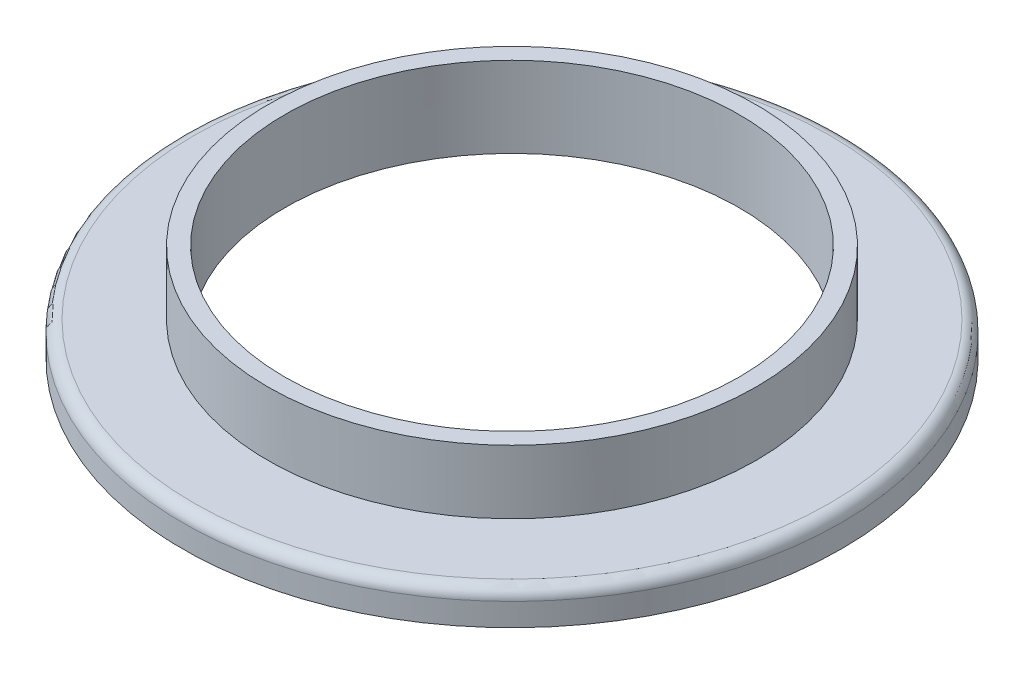
ISO-10303-21;
HEADER;
FILE_DESCRIPTION(('STEP AP214'),'2;1');
FILE_NAME('part.step','',(''),(''),'','','');
FILE_SCHEMA(('AUTOMOTIVE_DESIGN { 1 0 10303 214 1 1 1 1 }'));
ENDSEC;
DATA;
#1=APPLICATION_CONTEXT('core data for automotive mechanical design processes');
#2=APPLICATION_PROTOCOL_DEFINITION('international standard','automotive_design',2000,#1);
#3=PRODUCT_CONTEXT('',#1,'mechanical');
#4=PRODUCT('Part','Part','',(#3));
#5=PRODUCT_RELATED_PRODUCT_CATEGORY('part','',(#4));
#6=PRODUCT_DEFINITION_FORMATION('','',#4);
#7=PRODUCT_DEFINITION_CONTEXT('part definition',#1,'design');
#8=PRODUCT_DEFINITION('design','',#6,#7);
#9=PRODUCT_DEFINITION_SHAPE('','',#8);
#10=(LENGTH_UNIT() NAMED_UNIT(*) SI_UNIT(.MILLI.,.METRE.));
#11=(NAMED_UNIT(*) PLANE_ANGLE_UNIT() SI_UNIT($,.RADIAN.));
#12=(NAMED_UNIT(*) SI_UNIT($,.STERADIAN.) SOLID_ANGLE_UNIT());
#13=UNCERTAINTY_MEASURE_WITH_UNIT(LENGTH_MEASURE(1.E-05),#10,'distance_accuracy_value','');
#14=(GEOMETRIC_REPRESENTATION_CONTEXT(3) GLOBAL_UNCERTAINTY_ASSIGNED_CONTEXT((#13)) GLOBAL_UNIT_ASSIGNED_CONTEXT((#10,
#11,#12)) REPRESENTATION_CONTEXT('',''));
#15=CARTESIAN_POINT('',(0.,0.,0.));
#16=DIRECTION('',(0.,0.,1.));
#17=DIRECTION('',(1.,0.,0.));
#18=AXIS2_PLACEMENT_3D('',#15,#16,#17);
#19=CARTESIAN_POINT('',(0.,10.,0.));
#20=DIRECTION('',(0.,-1.,0.));
#21=DIRECTION('',(0.,0.,-1.));
#22=AXIS2_PLACEMENT_3D('',#19,#20,#21);
#23=CYLINDRICAL_SURFACE('',#22,20.);
#24=CARTESIAN_POINT('',(0.,10.,0.));
#25=DIRECTION('',(0.,1.,0.));
#26=DIRECTION('',(0.,0.,1.));
#27=AXIS2_PLACEMENT_3D('',#24,#25,#26);
#28=CIRCLE('',#27,20.);
#29=CARTESIAN_POINT('',(0.,10.,20.));
#30=VERTEX_POINT('',#29);
#31=EDGE_CURVE('E60',#30,#30,#28,.T.);
#32=ORIENTED_EDGE('',*,*,#31,.T.);
#33=EDGE_LOOP('',(#32));
#34=FACE_BOUND('',#33,.T.);
#35=CARTESIAN_POINT('',(0.,2.9,0.));
#36=DIRECTION('',(0.,-1.,0.));
#37=DIRECTION('',(1.,0.,0.));
#38=AXIS2_PLACEMENT_3D('',#35,#36,#37);
#39=CIRCLE('',#38,20.);
#40=CARTESIAN_POINT('',(20.,2.9,0.));
#41=VERTEX_POINT('',#40);
#42=EDGE_CURVE('E52',#41,#41,#39,.T.);
#43=ORIENTED_EDGE('',*,*,#42,.T.);
#44=EDGE_LOOP('',(#43));
#45=FACE_BOUND('',#44,.T.);
#46=ADVANCED_FACE('F31',(#34,#45),#23,.F.);
#47=CARTESIAN_POINT('',(0.,10.,0.));
#48=DIRECTION('',(0.,-1.,0.));
#49=DIRECTION('',(0.,0.,-1.));
#50=AXIS2_PLACEMENT_3D('',#47,#48,#49);
#51=CYLINDRICAL_SURFACE('',#50,21.5);
#52=CARTESIAN_POINT('',(0.,10.,0.));
#53=DIRECTION('',(0.,1.,0.));
#54=DIRECTION('',(0.,0.,1.));
#55=AXIS2_PLACEMENT_3D('',#52,#53,#54);
#56=CIRCLE('',#55,21.5);
#57=CARTESIAN_POINT('',(0.,10.,21.5));
#58=VERTEX_POINT('',#57);
#59=EDGE_CURVE('E57',#58,#58,#56,.T.);
#60=ORIENTED_EDGE('',*,*,#59,.F.);
#61=EDGE_LOOP('',(#60));
#62=FACE_BOUND('',#61,.T.);
#63=CARTESIAN_POINT('',(0.,4.4,0.));
#64=DIRECTION('',(0.,-1.,0.));
#65=DIRECTION('',(1.,0.,0.));
#66=AXIS2_PLACEMENT_3D('',#63,#64,#65);
#67=CIRCLE('',#66,21.5);
#68=CARTESIAN_POINT('',(21.5,4.4,0.));
#69=VERTEX_POINT('',#68);
#70=EDGE_CURVE('E51',#69,#69,#67,.T.);
#71=ORIENTED_EDGE('',*,*,#70,.F.);
#72=EDGE_LOOP('',(#71));
#73=FACE_BOUND('',#72,.T.);
#74=ADVANCED_FACE('F90',(#62,#73),#51,.T.);
#75=CARTESIAN_POINT('',(0.,10.,0.));
#76=DIRECTION('',(0.,1.,0.));
#77=DIRECTION('',(0.,0.,1.));
#78=AXIS2_PLACEMENT_3D('',#75,#76,#77);
#79=PLANE('',#78);
#80=ORIENTED_EDGE('',*,*,#59,.T.);
#81=EDGE_LOOP('',(#80));
#82=FACE_BOUND('',#81,.T.);
#83=ORIENTED_EDGE('',*,*,#31,.F.);
#84=EDGE_LOOP('',(#83));
#85=FACE_BOUND('',#84,.T.);
#86=ADVANCED_FACE('F95',(#82,#85),#79,.T.);
#87=CARTESIAN_POINT('',(0.,4.4,0.));
#88=DIRECTION('',(0.,-1.,0.));
#89=DIRECTION('',(1.,0.,0.));
#90=AXIS2_PLACEMENT_3D('',#87,#88,#89);
#91=PLANE('',#90);
#92=CARTESIAN_POINT('',(0.,4.4,0.));
#93=DIRECTION('',(0.,-1.,0.));
#94=DIRECTION('',(1.,0.,0.));
#95=AXIS2_PLACEMENT_3D('',#92,#93,#94);
#96=CIRCLE('',#95,28.);
#97=CARTESIAN_POINT('',(28.,4.4,0.));
#98=VERTEX_POINT('',#97);
#99=EDGE_CURVE('E42',#98,#98,#96,.F.);
#100=ORIENTED_EDGE('',*,*,#99,.T.);
#101=EDGE_LOOP('',(#100));
#102=FACE_BOUND('',#101,.T.);
#103=ORIENTED_EDGE('',*,*,#70,.T.);
#104=EDGE_LOOP('',(#103));
#105=FACE_BOUND('',#104,.T.);
#106=ADVANCED_FACE('F76',(#102,#105),#91,.F.);
#107=CARTESIAN_POINT('',(0.,1.4,0.));
#108=DIRECTION('',(0.,-1.,0.));
#109=DIRECTION('',(1.,0.,0.));
#110=AXIS2_PLACEMENT_3D('',#107,#108,#109);
#111=PLANE('',#110);
#112=CARTESIAN_POINT('',(0.,1.4,0.));
#113=DIRECTION('',(0.,-1.,0.));
#114=DIRECTION('',(1.,0.,0.));
#115=AXIS2_PLACEMENT_3D('',#112,#113,#114);
#116=CIRCLE('',#115,27.5);
#117=CARTESIAN_POINT('',(27.5,1.4,0.));
#118=VERTEX_POINT('',#117);
#119=EDGE_CURVE('E56',#118,#118,#116,.T.);
#120=ORIENTED_EDGE('',*,*,#119,.F.);
#121=EDGE_LOOP('',(#120));
#122=FACE_BOUND('',#121,.T.);
#123=CARTESIAN_POINT('',(0.,1.4,0.));
#124=DIRECTION('',(0.,-1.,0.));
#125=DIRECTION('',(1.,0.,0.));
#126=AXIS2_PLACEMENT_3D('',#123,#124,#125);
#127=CIRCLE('',#126,29.);
#128=CARTESIAN_POINT('',(29.,1.4,0.));
#129=VERTEX_POINT('',#128);
#130=EDGE_CURVE('E55',#129,#129,#127,.T.);
#131=ORIENTED_EDGE('',*,*,#130,.T.);
#132=EDGE_LOOP('',(#131));
#133=FACE_BOUND('',#132,.T.);
#134=ADVANCED_FACE('F72',(#122,#133),#111,.T.);
#135=CARTESIAN_POINT('',(0.,1.4,0.));
#136=DIRECTION('',(0.,1.,0.));
#137=DIRECTION('',(-1.,0.,0.));
#138=AXIS2_PLACEMENT_3D('',#135,#136,#137);
#139=CYLINDRICAL_SURFACE('',#138,29.);
#140=CARTESIAN_POINT('',(0.,3.4,0.));
#141=DIRECTION('',(0.,-1.,0.));
#142=DIRECTION('',(1.,0.,0.));
#143=AXIS2_PLACEMENT_3D('',#140,#141,#142);
#144=CIRCLE('',#143,29.);
#145=CARTESIAN_POINT('',(29.,3.4,0.));
#146=VERTEX_POINT('',#145);
#147=EDGE_CURVE('E46',#146,#146,#144,.T.);
#148=ORIENTED_EDGE('',*,*,#147,.T.);
#149=EDGE_LOOP('',(#148));
#150=FACE_BOUND('',#149,.T.);
#151=ORIENTED_EDGE('',*,*,#130,.F.);
#152=EDGE_LOOP('',(#151));
#153=FACE_BOUND('',#152,.T.);
#154=ADVANCED_FACE('F75',(#150,#153),#139,.T.);
#155=CARTESIAN_POINT('',(0.,2.9,0.));
#156=DIRECTION('',(0.,-1.,0.));
#157=DIRECTION('',(1.,0.,0.));
#158=AXIS2_PLACEMENT_3D('',#155,#156,#157);
#159=CYLINDRICAL_SURFACE('',#158,27.5);
#160=CARTESIAN_POINT('',(0.,1.9,0.));
#161=DIRECTION('',(0.,-1.,0.));
#162=DIRECTION('',(1.,0.,0.));
#163=AXIS2_PLACEMENT_3D('',#160,#161,#162);
#164=CIRCLE('',#163,27.5);
#165=CARTESIAN_POINT('',(27.5,1.9,0.));
#166=VERTEX_POINT('',#165);
#167=EDGE_CURVE('E10',#166,#166,#164,.F.);
#168=ORIENTED_EDGE('',*,*,#167,.T.);
#169=EDGE_LOOP('',(#168));
#170=FACE_BOUND('',#169,.T.);
#171=ORIENTED_EDGE('',*,*,#119,.T.);
#172=EDGE_LOOP('',(#171));
#173=FACE_BOUND('',#172,.T.);
#174=ADVANCED_FACE('F70',(#170,#173),#159,.F.);
#175=CARTESIAN_POINT('',(0.,2.9,0.));
#176=DIRECTION('',(0.,-1.,0.));
#177=DIRECTION('',(1.,0.,0.));
#178=AXIS2_PLACEMENT_3D('',#175,#176,#177);
#179=PLANE('',#178);
#180=CARTESIAN_POINT('',(0.,2.9,0.));
#181=DIRECTION('',(0.,-1.,0.));
#182=DIRECTION('',(1.,0.,0.));
#183=AXIS2_PLACEMENT_3D('',#180,#181,#182);
#184=CIRCLE('',#183,26.5);
#185=CARTESIAN_POINT('',(26.5,2.9,0.));
#186=VERTEX_POINT('',#185);
#187=EDGE_CURVE('E38',#186,#186,#184,.T.);
#188=ORIENTED_EDGE('',*,*,#187,.T.);
#189=EDGE_LOOP('',(#188));
#190=FACE_BOUND('',#189,.T.);
#191=ORIENTED_EDGE('',*,*,#42,.F.);
#192=EDGE_LOOP('',(#191));
#193=FACE_BOUND('',#192,.T.);
#194=ADVANCED_FACE('F86',(#190,#193),#179,.T.);
#195=CARTESIAN_POINT('',(0.,3.4,0.));
#196=DIRECTION('',(0.,-1.,0.));
#197=DIRECTION('',(1.,0.,0.));
#198=AXIS2_PLACEMENT_3D('',#195,#196,#197);
#199=TOROIDAL_SURFACE('',#198,28.,1.);
#200=ORIENTED_EDGE('',*,*,#99,.F.);
#201=EDGE_LOOP('',(#200));
#202=FACE_BOUND('',#201,.T.);
#203=ORIENTED_EDGE('',*,*,#147,.F.);
#204=EDGE_LOOP('',(#203));
#205=FACE_BOUND('',#204,.T.);
#206=ADVANCED_FACE('F102',(#202,#205),#199,.T.);
#207=CARTESIAN_POINT('',(0.,1.9,0.));
#208=DIRECTION('',(0.,-1.,0.));
#209=DIRECTION('',(1.,0.,0.));
#210=AXIS2_PLACEMENT_3D('',#207,#208,#209);
#211=TOROIDAL_SURFACE('',#210,26.5,1.);
#212=ORIENTED_EDGE('',*,*,#167,.F.);
#213=EDGE_LOOP('',(#212));
#214=FACE_BOUND('',#213,.T.);
#215=ORIENTED_EDGE('',*,*,#187,.F.);
#216=EDGE_LOOP('',(#215));
#217=FACE_BOUND('',#216,.T.);
#218=ADVANCED_FACE('F33',(#214,#217),#211,.F.);
#219=CLOSED_SHELL('',(#46,#74,#86,#106,#134,#154,#174,#194,#206,#218));
#220=MANIFOLD_SOLID_BREP('B2',#219);
#221=ADVANCED_BREP_SHAPE_REPRESENTATION('',(#18,#220),#14);
#222=SHAPE_DEFINITION_REPRESENTATION(#9,#221);
ENDSEC;
END-ISO-10303-21;
